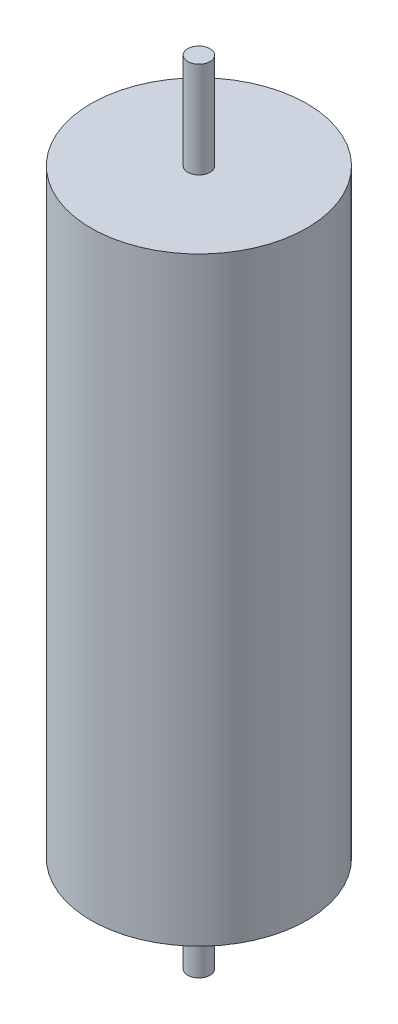
ISO-10303-21;
HEADER;
FILE_DESCRIPTION(('STEP AP214'),'2;1');
FILE_NAME('part.step','',(''),(''),'','','');
FILE_SCHEMA(('AUTOMOTIVE_DESIGN { 1 0 10303 214 1 1 1 1 }'));
ENDSEC;
DATA;
#1=APPLICATION_CONTEXT('core data for automotive mechanical design processes');
#2=APPLICATION_PROTOCOL_DEFINITION('international standard','automotive_design',2000,#1);
#3=PRODUCT_CONTEXT('',#1,'mechanical');
#4=PRODUCT('Part','Part','',(#3));
#5=PRODUCT_RELATED_PRODUCT_CATEGORY('part','',(#4));
#6=PRODUCT_DEFINITION_FORMATION('','',#4);
#7=PRODUCT_DEFINITION_CONTEXT('part definition',#1,'design');
#8=PRODUCT_DEFINITION('design','',#6,#7);
#9=PRODUCT_DEFINITION_SHAPE('','',#8);
#10=(LENGTH_UNIT() NAMED_UNIT(*) SI_UNIT(.MILLI.,.METRE.));
#11=(NAMED_UNIT(*) PLANE_ANGLE_UNIT() SI_UNIT($,.RADIAN.));
#12=(NAMED_UNIT(*) SI_UNIT($,.STERADIAN.) SOLID_ANGLE_UNIT());
#13=UNCERTAINTY_MEASURE_WITH_UNIT(LENGTH_MEASURE(1.E-05),#10,'distance_accuracy_value','');
#14=(GEOMETRIC_REPRESENTATION_CONTEXT(3) GLOBAL_UNCERTAINTY_ASSIGNED_CONTEXT((#13)) GLOBAL_UNIT_ASSIGNED_CONTEXT((#10,
#11,#12)) REPRESENTATION_CONTEXT('',''));
#15=CARTESIAN_POINT('',(0.,0.,0.));
#16=DIRECTION('',(0.,0.,1.));
#17=DIRECTION('',(1.,0.,0.));
#18=AXIS2_PLACEMENT_3D('',#15,#16,#17);
#19=CARTESIAN_POINT('',(0.,317.5,0.));
#20=DIRECTION('',(0.,-1.,0.));
#21=DIRECTION('',(0.,0.,-1.));
#22=AXIS2_PLACEMENT_3D('',#19,#20,#21);
#23=CYLINDRICAL_SURFACE('',#22,114.3);
#24=CARTESIAN_POINT('',(0.,317.5,0.));
#25=DIRECTION('',(0.,1.,0.));
#26=DIRECTION('',(0.,0.,1.));
#27=AXIS2_PLACEMENT_3D('',#24,#25,#26);
#28=CIRCLE('',#27,114.3);
#29=CARTESIAN_POINT('',(0.,317.5,-114.3));
#30=VERTEX_POINT('',#29);
#31=EDGE_CURVE('E44',#30,#30,#28,.T.);
#32=CARTESIAN_POINT('',(0.,-317.5,0.));
#33=DIRECTION('',(0.,1.,0.));
#34=DIRECTION('',(0.,0.,1.));
#35=AXIS2_PLACEMENT_3D('',#32,#33,#34);
#36=CIRCLE('',#35,114.3);
#37=CARTESIAN_POINT('',(0.,-317.5,-114.3));
#38=VERTEX_POINT('',#37);
#39=EDGE_CURVE('E49',#38,#38,#36,.T.);
#40=CARTESIAN_POINT('',(0.,317.5,-114.3));
#41=CARTESIAN_POINT('',(0.,310.885416666667,-114.3));
#42=CARTESIAN_POINT('',(0.,304.270833333333,-114.3));
#43=CARTESIAN_POINT('',(0.,291.041666666667,-114.3));
#44=CARTESIAN_POINT('',(0.,284.427083333333,-114.3));
#45=CARTESIAN_POINT('',(0.,271.197916666667,-114.3));
#46=CARTESIAN_POINT('',(0.,264.583333333333,-114.3));
#47=CARTESIAN_POINT('',(0.,251.354166666667,-114.3));
#48=CARTESIAN_POINT('',(0.,244.739583333333,-114.3));
#49=CARTESIAN_POINT('',(0.,231.510416666667,-114.3));
#50=CARTESIAN_POINT('',(0.,224.895833333333,-114.3));
#51=CARTESIAN_POINT('',(0.,211.666666666667,-114.3));
#52=CARTESIAN_POINT('',(0.,205.052083333333,-114.3));
#53=CARTESIAN_POINT('',(0.,191.822916666667,-114.3));
#54=CARTESIAN_POINT('',(0.,185.208333333333,-114.3));
#55=CARTESIAN_POINT('',(0.,171.979166666667,-114.3));
#56=CARTESIAN_POINT('',(0.,165.364583333333,-114.3));
#57=CARTESIAN_POINT('',(0.,152.135416666667,-114.3));
#58=CARTESIAN_POINT('',(0.,145.520833333333,-114.3));
#59=CARTESIAN_POINT('',(0.,132.291666666667,-114.3));
#60=CARTESIAN_POINT('',(0.,125.677083333333,-114.3));
#61=CARTESIAN_POINT('',(0.,112.447916666667,-114.3));
#62=CARTESIAN_POINT('',(0.,105.833333333333,-114.3));
#63=CARTESIAN_POINT('',(0.,92.6041666666666,-114.3));
#64=CARTESIAN_POINT('',(0.,85.9895833333332,-114.3));
#65=CARTESIAN_POINT('',(0.,72.7604166666666,-114.3));
#66=CARTESIAN_POINT('',(0.,66.1458333333333,-114.3));
#67=CARTESIAN_POINT('',(0.,52.9166666666666,-114.3));
#68=CARTESIAN_POINT('',(0.,46.3020833333332,-114.3));
#69=CARTESIAN_POINT('',(0.,33.0729166666666,-114.3));
#70=CARTESIAN_POINT('',(0.,26.4583333333332,-114.3));
#71=CARTESIAN_POINT('',(0.,13.2291666666665,-114.3));
#72=CARTESIAN_POINT('',(0.,6.61458333333322,-114.3));
#73=CARTESIAN_POINT('',(0.,-6.61458333333344,-114.3));
#74=CARTESIAN_POINT('',(0.,-13.2291666666668,-114.3));
#75=CARTESIAN_POINT('',(0.,-26.4583333333334,-114.3));
#76=CARTESIAN_POINT('',(0.,-33.0729166666668,-114.3));
#77=CARTESIAN_POINT('',(0.,-46.3020833333334,-114.3));
#78=CARTESIAN_POINT('',(0.,-52.9166666666668,-114.3));
#79=CARTESIAN_POINT('',(0.,-66.1458333333335,-114.3));
#80=CARTESIAN_POINT('',(0.,-72.7604166666668,-114.3));
#81=CARTESIAN_POINT('',(0.,-85.9895833333335,-114.3));
#82=CARTESIAN_POINT('',(0.,-92.6041666666668,-114.3));
#83=CARTESIAN_POINT('',(0.,-105.833333333333,-114.3));
#84=CARTESIAN_POINT('',(0.,-112.447916666667,-114.3));
#85=CARTESIAN_POINT('',(0.,-125.677083333334,-114.3));
#86=CARTESIAN_POINT('',(0.,-132.291666666667,-114.3));
#87=CARTESIAN_POINT('',(0.,-145.520833333334,-114.3));
#88=CARTESIAN_POINT('',(0.,-152.135416666667,-114.3));
#89=CARTESIAN_POINT('',(0.,-165.364583333334,-114.3));
#90=CARTESIAN_POINT('',(0.,-171.979166666667,-114.3));
#91=CARTESIAN_POINT('',(0.,-185.208333333333,-114.3));
#92=CARTESIAN_POINT('',(0.,-191.822916666667,-114.3));
#93=CARTESIAN_POINT('',(0.,-205.052083333333,-114.3));
#94=CARTESIAN_POINT('',(0.,-211.666666666667,-114.3));
#95=CARTESIAN_POINT('',(0.,-224.895833333333,-114.3));
#96=CARTESIAN_POINT('',(0.,-231.510416666667,-114.3));
#97=CARTESIAN_POINT('',(0.,-244.739583333333,-114.3));
#98=CARTESIAN_POINT('',(0.,-251.354166666667,-114.3));
#99=CARTESIAN_POINT('',(0.,-264.583333333333,-114.3));
#100=CARTESIAN_POINT('',(0.,-271.197916666667,-114.3));
#101=CARTESIAN_POINT('',(0.,-284.427083333333,-114.3));
#102=CARTESIAN_POINT('',(0.,-291.041666666667,-114.3));
#103=CARTESIAN_POINT('',(0.,-304.270833333333,-114.3));
#104=CARTESIAN_POINT('',(0.,-310.885416666667,-114.3));
#105=CARTESIAN_POINT('',(0.,-317.5,-114.3));
#106=B_SPLINE_CURVE_WITH_KNOTS('',3,(#40,#41,#42,#43,#44,#45,#46,#47,#48,#49,#50,#51,#52,#53,
#54,#55,#56,#57,#58,#59,#60,#61,#62,#63,#64,#65,#66,#67,#68,#69,#70,#71,#72,#73,#74,#75,#76,#77,
#78,#79,#80,#81,#82,#83,#84,#85,#86,#87,#88,#89,#90,#91,#92,#93,#94,#95,#96,#97,#98,#99,#100,
#101,#102,#103,#104,#105),.UNSPECIFIED.,.F.,.F.,(4,2,2,2,2,2,2,2,2,2,2,2,2,2,2,2,2,2,2,2,2,2,2,
2,2,2,2,2,2,2,2,2,4),(0.,19.84375,39.6875,59.53125,79.375,99.21875,119.0625,138.90625,158.75,
178.59375,198.4375,218.28125,238.125,257.96875,277.8125,297.65625,317.5,337.34375,357.1875,
377.03125,396.875,416.71875,436.5625,456.40625,476.25,496.09375,515.9375,535.78125,555.625,
575.46875,595.3125,615.15625,635.),.UNSPECIFIED.);
#107=EDGE_CURVE('BSEAM37',#30,#38,#106,.T.);
#108=ORIENTED_EDGE('',*,*,#31,.F.);
#109=ORIENTED_EDGE('',*,*,#39,.T.);
#110=ORIENTED_EDGE('',*,*,#107,.T.);
#111=ORIENTED_EDGE('',*,*,#107,.F.);
#112=EDGE_LOOP('',(#108,#110,#109,#111));
#113=FACE_BOUND('',#112,.T.);
#114=ADVANCED_FACE('F37',(#113),#23,.T.);
#115=CARTESIAN_POINT('',(0.,317.5,0.));
#116=DIRECTION('',(0.,1.,0.));
#117=DIRECTION('',(0.,0.,1.));
#118=AXIS2_PLACEMENT_3D('',#115,#116,#117);
#119=PLANE('',#118);
#120=CARTESIAN_POINT('',(0.,317.5,0.));
#121=DIRECTION('',(0.,1.,0.));
#122=DIRECTION('',(0.,0.,1.));
#123=AXIS2_PLACEMENT_3D('',#120,#121,#122);
#124=CIRCLE('',#123,11.811);
#125=CARTESIAN_POINT('',(0.,317.5,11.811));
#126=VERTEX_POINT('',#125);
#127=EDGE_CURVE('E57',#126,#126,#124,.T.);
#128=ORIENTED_EDGE('',*,*,#127,.F.);
#129=EDGE_LOOP('',(#128));
#130=FACE_BOUND('',#129,.T.);
#131=ORIENTED_EDGE('',*,*,#31,.T.);
#132=EDGE_LOOP('',(#131));
#133=FACE_BOUND('',#132,.T.);
#134=ADVANCED_FACE('F84',(#130,#133),#119,.T.);
#135=CARTESIAN_POINT('',(0.,-317.5,0.));
#136=DIRECTION('',(0.,1.,0.));
#137=DIRECTION('',(0.,0.,1.));
#138=AXIS2_PLACEMENT_3D('',#135,#136,#137);
#139=PLANE('',#138);
#140=CARTESIAN_POINT('',(0.,-317.5,0.));
#141=DIRECTION('',(0.,1.,0.));
#142=DIRECTION('',(0.,0.,1.));
#143=AXIS2_PLACEMENT_3D('',#140,#141,#142);
#144=CIRCLE('',#143,11.811);
#145=CARTESIAN_POINT('',(0.,-317.5,11.811));
#146=VERTEX_POINT('',#145);
#147=EDGE_CURVE('E10',#146,#146,#144,.F.);
#148=ORIENTED_EDGE('',*,*,#147,.F.);
#149=EDGE_LOOP('',(#148));
#150=FACE_BOUND('',#149,.T.);
#151=ORIENTED_EDGE('',*,*,#39,.F.);
#152=EDGE_LOOP('',(#151));
#153=FACE_BOUND('',#152,.T.);
#154=ADVANCED_FACE('F89',(#150,#153),#139,.F.);
#155=CARTESIAN_POINT('',(0.,419.1,0.));
#156=DIRECTION('',(0.,-1.,0.));
#157=DIRECTION('',(0.,0.,-1.));
#158=AXIS2_PLACEMENT_3D('',#155,#156,#157);
#159=CYLINDRICAL_SURFACE('',#158,11.811);
#160=CARTESIAN_POINT('',(0.,419.1,0.));
#161=DIRECTION('',(0.,1.,0.));
#162=DIRECTION('',(0.,0.,1.));
#163=AXIS2_PLACEMENT_3D('',#160,#161,#162);
#164=CIRCLE('',#163,11.811);
#165=CARTESIAN_POINT('',(0.,419.1,11.811));
#166=VERTEX_POINT('',#165);
#167=EDGE_CURVE('E55',#166,#166,#164,.T.);
#168=ORIENTED_EDGE('',*,*,#167,.F.);
#169=EDGE_LOOP('',(#168));
#170=FACE_BOUND('',#169,.T.);
#171=ORIENTED_EDGE('',*,*,#127,.T.);
#172=EDGE_LOOP('',(#171));
#173=FACE_BOUND('',#172,.T.);
#174=ADVANCED_FACE('F80',(#170,#173),#159,.T.);
#175=CARTESIAN_POINT('',(0.,419.1,0.));
#176=DIRECTION('',(0.,1.,0.));
#177=DIRECTION('',(0.,0.,1.));
#178=AXIS2_PLACEMENT_3D('',#175,#176,#177);
#179=PLANE('',#178);
#180=ORIENTED_EDGE('',*,*,#167,.T.);
#181=EDGE_LOOP('',(#180));
#182=FACE_BOUND('',#181,.T.);
#183=ADVANCED_FACE('F73',(#182),#179,.T.);
#184=CARTESIAN_POINT('',(0.,-419.1,0.));
#185=DIRECTION('',(0.,1.,0.));
#186=DIRECTION('',(0.,0.,1.));
#187=AXIS2_PLACEMENT_3D('',#184,#185,#186);
#188=CYLINDRICAL_SURFACE('',#187,11.811);
#189=CARTESIAN_POINT('',(0.,-419.1,0.));
#190=DIRECTION('',(0.,-1.,0.));
#191=DIRECTION('',(0.,0.,-1.));
#192=AXIS2_PLACEMENT_3D('',#189,#190,#191);
#193=CIRCLE('',#192,11.811);
#194=CARTESIAN_POINT('',(0.,-419.1,-11.811));
#195=VERTEX_POINT('',#194);
#196=EDGE_CURVE('E61',#195,#195,#193,.T.);
#197=ORIENTED_EDGE('',*,*,#196,.F.);
#198=EDGE_LOOP('',(#197));
#199=FACE_BOUND('',#198,.T.);
#200=ORIENTED_EDGE('',*,*,#147,.T.);
#201=EDGE_LOOP('',(#200));
#202=FACE_BOUND('',#201,.T.);
#203=ADVANCED_FACE('F71',(#199,#202),#188,.T.);
#204=CARTESIAN_POINT('',(0.,-419.1,0.));
#205=DIRECTION('',(0.,-1.,0.));
#206=DIRECTION('',(0.,0.,-1.));
#207=AXIS2_PLACEMENT_3D('',#204,#205,#206);
#208=PLANE('',#207);
#209=ORIENTED_EDGE('',*,*,#196,.T.);
#210=EDGE_LOOP('',(#209));
#211=FACE_BOUND('',#210,.T.);
#212=ADVANCED_FACE('F69',(#211),#208,.T.);
#213=CLOSED_SHELL('',(#114,#134,#154,#174,#183,#203,#212));
#214=MANIFOLD_SOLID_BREP('B2',#213);
#215=ADVANCED_BREP_SHAPE_REPRESENTATION('',(#18,#214),#14);
#216=SHAPE_DEFINITION_REPRESENTATION(#9,#215);
ENDSEC;
END-ISO-10303-21;
